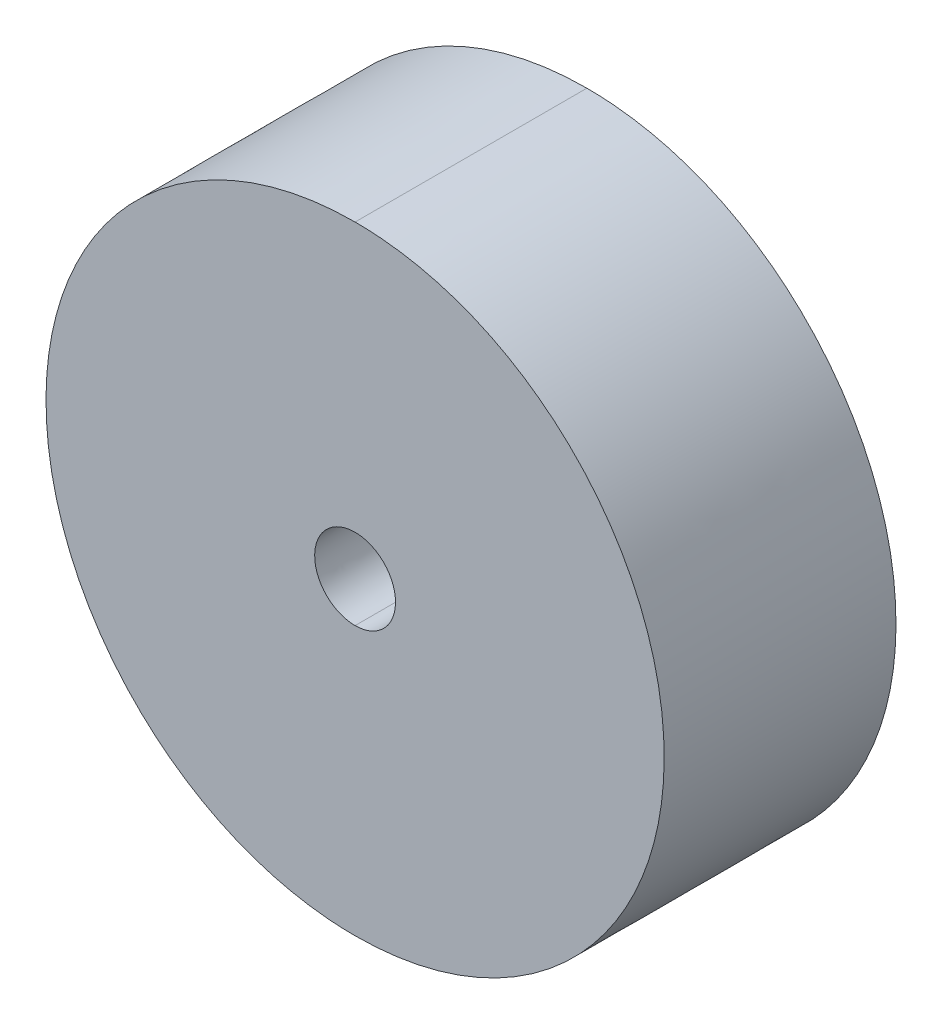
ISO-10303-21;
HEADER;
FILE_DESCRIPTION(('STEP AP214'),'2;1');
FILE_NAME('part.step','',(''),(''),'','','');
FILE_SCHEMA(('AUTOMOTIVE_DESIGN { 1 0 10303 214 1 1 1 1 }'));
ENDSEC;
DATA;
#1=APPLICATION_CONTEXT('core data for automotive mechanical design processes');
#2=APPLICATION_PROTOCOL_DEFINITION('international standard','automotive_design',2000,#1);
#3=PRODUCT_CONTEXT('',#1,'mechanical');
#4=PRODUCT('Part','Part','',(#3));
#5=PRODUCT_RELATED_PRODUCT_CATEGORY('part','',(#4));
#6=PRODUCT_DEFINITION_FORMATION('','',#4);
#7=PRODUCT_DEFINITION_CONTEXT('part definition',#1,'design');
#8=PRODUCT_DEFINITION('design','',#6,#7);
#9=PRODUCT_DEFINITION_SHAPE('','',#8);
#10=(LENGTH_UNIT() NAMED_UNIT(*) SI_UNIT(.MILLI.,.METRE.));
#11=(NAMED_UNIT(*) PLANE_ANGLE_UNIT() SI_UNIT($,.RADIAN.));
#12=(NAMED_UNIT(*) SI_UNIT($,.STERADIAN.) SOLID_ANGLE_UNIT());
#13=UNCERTAINTY_MEASURE_WITH_UNIT(LENGTH_MEASURE(1.E-05),#10,'distance_accuracy_value','');
#14=(GEOMETRIC_REPRESENTATION_CONTEXT(3) GLOBAL_UNCERTAINTY_ASSIGNED_CONTEXT((#13)) GLOBAL_UNIT_ASSIGNED_CONTEXT((#10,
#11,#12)) REPRESENTATION_CONTEXT('',''));
#15=CARTESIAN_POINT('',(0.,0.,0.));
#16=DIRECTION('',(0.,0.,1.));
#17=DIRECTION('',(1.,0.,0.));
#18=AXIS2_PLACEMENT_3D('',#15,#16,#17);
#19=CARTESIAN_POINT('',(152.633205364228,-65.4287373910405,3.175));
#20=DIRECTION('',(0.,0.,-1.));
#21=DIRECTION('',(-1.,0.,0.));
#22=AXIS2_PLACEMENT_3D('',#19,#20,#21);
#23=PLANE('',#22);
#24=CARTESIAN_POINT('',(156.866538697561,-61.195425589554,3.175));
#25=CARTESIAN_POINT('',(154.528481582219,-61.195425589554,3.175));
#26=CARTESIAN_POINT('',(152.633205364228,-63.0906802756977,3.175));
#27=CARTESIAN_POINT('',(152.633205364228,-65.4287373910405,3.175));
#28=CARTESIAN_POINT('',(152.633205364228,-67.7668160382302,3.175));
#29=CARTESIAN_POINT('',(154.528481582219,-69.6620707243739,3.175));
#30=CARTESIAN_POINT('',(156.866538697561,-69.6620707243739,3.175));
#31=B_SPLINE_CURVE_WITH_KNOTS('',3,(#24,#25,#26,#27,#28,#29,#30),.UNSPECIFIED.,.F.,.F.,(4,3,4),
(0.,1.,2.),.UNSPECIFIED.);
#32=CARTESIAN_POINT('',(156.866538697561,-61.195425589554,3.175));
#33=VERTEX_POINT('',#32);
#34=CARTESIAN_POINT('',(156.866538697561,-69.6620707243739,3.175));
#35=VERTEX_POINT('',#34);
#36=EDGE_CURVE('E116',#33,#35,#31,.T.);
#37=ORIENTED_EDGE('',*,*,#36,.T.);
#38=CARTESIAN_POINT('',(156.866538697561,-69.6620707243739,3.175));
#39=CARTESIAN_POINT('',(159.2046388766,-69.6620707243739,3.175));
#40=CARTESIAN_POINT('',(161.099872030895,-67.7668160382302,3.175));
#41=CARTESIAN_POINT('',(161.099872030895,-65.4287373910405,3.175));
#42=CARTESIAN_POINT('',(161.099872030895,-63.0906802756977,3.175));
#43=CARTESIAN_POINT('',(159.2046388766,-61.195425589554,3.175));
#44=CARTESIAN_POINT('',(156.866538697561,-61.195425589554,3.175));
#45=B_SPLINE_CURVE_WITH_KNOTS('',3,(#38,#39,#40,#41,#42,#43,#44),.UNSPECIFIED.,.F.,.F.,(4,3,4),
(2.,3.,4.),.UNSPECIFIED.);
#46=EDGE_CURVE('E111',#35,#33,#45,.T.);
#47=ORIENTED_EDGE('',*,*,#46,.T.);
#48=EDGE_LOOP('',(#37,#47));
#49=FACE_BOUND('',#48,.T.);
#50=CARTESIAN_POINT('',(156.866538697561,-64.8751320782693,3.175));
#51=CARTESIAN_POINT('',(156.560786473169,-64.8751320782693,3.175));
#52=CARTESIAN_POINT('',(156.312911852943,-65.1229851666482,3.175));
#53=CARTESIAN_POINT('',(156.312911852943,-65.4287373910405,3.175));
#54=CARTESIAN_POINT('',(156.312911852943,-65.7345111472797,3.175));
#55=CARTESIAN_POINT('',(156.560786473169,-65.9823642356586,3.175));
#56=CARTESIAN_POINT('',(156.866538697561,-65.9823642356586,3.175));
#57=B_SPLINE_CURVE_WITH_KNOTS('',3,(#50,#51,#52,#53,#54,#55,#56),.UNSPECIFIED.,.F.,.F.,(4,3,4),
(0.,1.,2.),.UNSPECIFIED.);
#58=CARTESIAN_POINT('',(156.866538697561,-64.8751320782693,3.175));
#59=VERTEX_POINT('',#58);
#60=CARTESIAN_POINT('',(156.866538697561,-65.9823642356586,3.175));
#61=VERTEX_POINT('',#60);
#62=EDGE_CURVE('E80',#59,#61,#57,.T.);
#63=ORIENTED_EDGE('',*,*,#62,.F.);
#64=CARTESIAN_POINT('',(156.866538697561,-65.9823642356586,3.175));
#65=CARTESIAN_POINT('',(157.172290921954,-65.9823642356586,3.175));
#66=CARTESIAN_POINT('',(157.42016554218,-65.7345111472797,3.175));
#67=CARTESIAN_POINT('',(157.42016554218,-65.4287373910405,3.175));
#68=CARTESIAN_POINT('',(157.42016554218,-65.1229851666482,3.175));
#69=CARTESIAN_POINT('',(157.172290921954,-64.8751320782693,3.175));
#70=CARTESIAN_POINT('',(156.866538697561,-64.8751320782693,3.175));
#71=B_SPLINE_CURVE_WITH_KNOTS('',3,(#64,#65,#66,#67,#68,#69,#70),.UNSPECIFIED.,.F.,.F.,(4,3,4),
(2.,3.,4.),.UNSPECIFIED.);
#72=EDGE_CURVE('E74',#61,#59,#71,.T.);
#73=ORIENTED_EDGE('',*,*,#72,.F.);
#74=EDGE_LOOP('',(#63,#73));
#75=FACE_BOUND('',#74,.T.);
#76=ADVANCED_FACE('F33',(#49,#75),#23,.F.);
#77=CARTESIAN_POINT('',(152.633205364228,-65.4287373910405,0.));
#78=DIRECTION('',(0.,0.,-1.));
#79=DIRECTION('',(-1.,0.,0.));
#80=AXIS2_PLACEMENT_3D('',#77,#78,#79);
#81=PLANE('',#80);
#82=CARTESIAN_POINT('',(156.866538697561,-61.195425589554,0.));
#83=CARTESIAN_POINT('',(154.528481582219,-61.195425589554,0.));
#84=CARTESIAN_POINT('',(152.633205364228,-63.0906802756977,0.));
#85=CARTESIAN_POINT('',(152.633205364228,-65.4287373910405,0.));
#86=CARTESIAN_POINT('',(152.633205364228,-67.7668160382302,0.));
#87=CARTESIAN_POINT('',(154.528481582219,-69.6620707243739,0.));
#88=CARTESIAN_POINT('',(156.866538697561,-69.6620707243739,0.));
#89=B_SPLINE_CURVE_WITH_KNOTS('',3,(#82,#83,#84,#85,#86,#87,#88),.UNSPECIFIED.,.F.,.F.,(4,3,4),
(0.,1.,2.),.UNSPECIFIED.);
#90=CARTESIAN_POINT('',(156.866538697561,-61.195425589554,0.));
#91=VERTEX_POINT('',#90);
#92=CARTESIAN_POINT('',(156.866538697561,-69.6620707243739,0.));
#93=VERTEX_POINT('',#92);
#94=EDGE_CURVE('E121',#91,#93,#89,.T.);
#95=ORIENTED_EDGE('',*,*,#94,.F.);
#96=CARTESIAN_POINT('',(156.866538697561,-69.6620707243739,0.));
#97=CARTESIAN_POINT('',(159.2046388766,-69.6620707243739,0.));
#98=CARTESIAN_POINT('',(161.099872030895,-67.7668160382302,0.));
#99=CARTESIAN_POINT('',(161.099872030895,-65.4287373910405,0.));
#100=CARTESIAN_POINT('',(161.099872030895,-63.0906802756977,0.));
#101=CARTESIAN_POINT('',(159.2046388766,-61.195425589554,0.));
#102=CARTESIAN_POINT('',(156.866538697561,-61.195425589554,0.));
#103=B_SPLINE_CURVE_WITH_KNOTS('',3,(#96,#97,#98,#99,#100,#101,#102),.UNSPECIFIED.,.F.,.F.,(4,3,
4),(2.,3.,4.),.UNSPECIFIED.);
#104=EDGE_CURVE('E129',#93,#91,#103,.T.);
#105=ORIENTED_EDGE('',*,*,#104,.F.);
#106=EDGE_LOOP('',(#95,#105));
#107=FACE_BOUND('',#106,.T.);
#108=CARTESIAN_POINT('',(156.866538697561,-65.9823642356586,0.));
#109=CARTESIAN_POINT('',(157.172290921954,-65.9823642356586,0.));
#110=CARTESIAN_POINT('',(157.42016554218,-65.7345111472797,0.));
#111=CARTESIAN_POINT('',(157.42016554218,-65.4287373910405,0.));
#112=CARTESIAN_POINT('',(157.42016554218,-65.1229851666482,0.));
#113=CARTESIAN_POINT('',(157.172290921954,-64.8751320782693,0.));
#114=CARTESIAN_POINT('',(156.866538697561,-64.8751320782693,0.));
#115=B_SPLINE_CURVE_WITH_KNOTS('',3,(#108,#109,#110,#111,#112,#113,#114),.UNSPECIFIED.,.F.,.F.,
(4,3,4),(2.,3.,4.),.UNSPECIFIED.);
#116=CARTESIAN_POINT('',(156.866538697561,-65.9823642356586,0.));
#117=VERTEX_POINT('',#116);
#118=CARTESIAN_POINT('',(156.866538697561,-64.8751320782693,0.));
#119=VERTEX_POINT('',#118);
#120=EDGE_CURVE('E84',#117,#119,#115,.T.);
#121=ORIENTED_EDGE('',*,*,#120,.T.);
#122=CARTESIAN_POINT('',(156.866538697561,-64.8751320782693,0.));
#123=CARTESIAN_POINT('',(156.560786473169,-64.8751320782693,0.));
#124=CARTESIAN_POINT('',(156.312911852943,-65.1229851666482,0.));
#125=CARTESIAN_POINT('',(156.312911852943,-65.4287373910405,0.));
#126=CARTESIAN_POINT('',(156.312911852943,-65.7345111472797,0.));
#127=CARTESIAN_POINT('',(156.560786473169,-65.9823642356586,0.));
#128=CARTESIAN_POINT('',(156.866538697561,-65.9823642356586,0.));
#129=B_SPLINE_CURVE_WITH_KNOTS('',3,(#122,#123,#124,#125,#126,#127,#128),.UNSPECIFIED.,.F.,.F.,
(4,3,4),(0.,1.,2.),.UNSPECIFIED.);
#130=EDGE_CURVE('E56',#119,#117,#129,.T.);
#131=ORIENTED_EDGE('',*,*,#130,.T.);
#132=EDGE_LOOP('',(#121,#131));
#133=FACE_BOUND('',#132,.T.);
#134=ADVANCED_FACE('F104',(#107,#133),#81,.T.);
#135=DIRECTION('',(0.,0.,-1.));
#136=VECTOR('',#135,1.);
#137=SURFACE_OF_LINEAR_EXTRUSION('',#31,#136);
#138=ORIENTED_EDGE('',*,*,#94,.T.);
#139=DIRECTION('',(0.,0.,-1.));
#140=VECTOR('',#139,1.);
#141=CARTESIAN_POINT('',(156.866538697561,-69.6620707243739,3.175));
#142=LINE('',#141,#140);
#143=EDGE_CURVE('E11',#35,#93,#142,.T.);
#144=ORIENTED_EDGE('',*,*,#143,.F.);
#145=ORIENTED_EDGE('',*,*,#36,.F.);
#146=DIRECTION('',(0.,0.,-1.));
#147=VECTOR('',#146,1.);
#148=CARTESIAN_POINT('',(156.866538697561,-61.195425589554,3.175));
#149=LINE('',#148,#147);
#150=EDGE_CURVE('E42',#33,#91,#149,.T.);
#151=ORIENTED_EDGE('',*,*,#150,.T.);
#152=EDGE_LOOP('',(#138,#144,#145,#151));
#153=FACE_BOUND('',#152,.T.);
#154=ADVANCED_FACE('F35',(#153),#137,.F.);
#155=DIRECTION('',(0.,0.,-1.));
#156=VECTOR('',#155,1.);
#157=SURFACE_OF_LINEAR_EXTRUSION('',#45,#156);
#158=ORIENTED_EDGE('',*,*,#104,.T.);
#159=ORIENTED_EDGE('',*,*,#150,.F.);
#160=ORIENTED_EDGE('',*,*,#46,.F.);
#161=ORIENTED_EDGE('',*,*,#143,.T.);
#162=EDGE_LOOP('',(#158,#159,#160,#161));
#163=FACE_BOUND('',#162,.T.);
#164=ADVANCED_FACE('F101',(#163),#157,.F.);
#165=DIRECTION('',(0.,0.,-1.));
#166=VECTOR('',#165,1.);
#167=SURFACE_OF_LINEAR_EXTRUSION('',#57,#166);
#168=ORIENTED_EDGE('',*,*,#130,.F.);
#169=DIRECTION('',(0.,0.,-1.));
#170=VECTOR('',#169,1.);
#171=CARTESIAN_POINT('',(156.866538697561,-64.8751320782693,3.175));
#172=LINE('',#171,#170);
#173=EDGE_CURVE('E76',#59,#119,#172,.T.);
#174=ORIENTED_EDGE('',*,*,#173,.F.);
#175=ORIENTED_EDGE('',*,*,#62,.T.);
#176=DIRECTION('',(0.,0.,-1.));
#177=VECTOR('',#176,1.);
#178=CARTESIAN_POINT('',(156.866538697561,-65.9823642356586,3.175));
#179=LINE('',#178,#177);
#180=EDGE_CURVE('E49',#61,#117,#179,.T.);
#181=ORIENTED_EDGE('',*,*,#180,.T.);
#182=EDGE_LOOP('',(#168,#174,#175,#181));
#183=FACE_BOUND('',#182,.T.);
#184=ADVANCED_FACE('F82',(#183),#167,.T.);
#185=DIRECTION('',(0.,0.,-1.));
#186=VECTOR('',#185,1.);
#187=SURFACE_OF_LINEAR_EXTRUSION('',#71,#186);
#188=ORIENTED_EDGE('',*,*,#120,.F.);
#189=ORIENTED_EDGE('',*,*,#180,.F.);
#190=ORIENTED_EDGE('',*,*,#72,.T.);
#191=ORIENTED_EDGE('',*,*,#173,.T.);
#192=EDGE_LOOP('',(#188,#189,#190,#191));
#193=FACE_BOUND('',#192,.T.);
#194=ADVANCED_FACE('F75',(#193),#187,.T.);
#195=CLOSED_SHELL('',(#76,#134,#154,#164,#184,#194));
#196=MANIFOLD_SOLID_BREP('B2',#195);
#197=ADVANCED_BREP_SHAPE_REPRESENTATION('',(#18,#196),#14);
#198=SHAPE_DEFINITION_REPRESENTATION(#9,#197);
ENDSEC;
END-ISO-10303-21;
